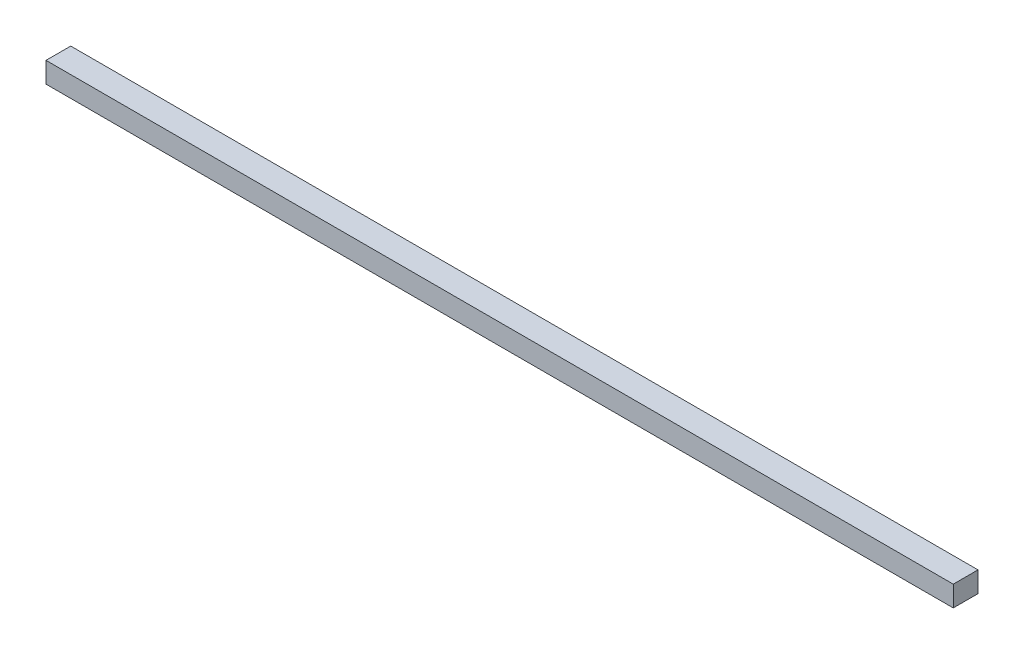
ISO-10303-21;
HEADER;
FILE_DESCRIPTION(('STEP AP214'),'2;1');
FILE_NAME('part.step','',(''),(''),'','','');
FILE_SCHEMA(('AUTOMOTIVE_DESIGN { 1 0 10303 214 1 1 1 1 }'));
ENDSEC;
DATA;
#1=APPLICATION_CONTEXT('core data for automotive mechanical design processes');
#2=APPLICATION_PROTOCOL_DEFINITION('international standard','automotive_design',2000,#1);
#3=PRODUCT_CONTEXT('',#1,'mechanical');
#4=PRODUCT('Part','Part','',(#3));
#5=PRODUCT_RELATED_PRODUCT_CATEGORY('part','',(#4));
#6=PRODUCT_DEFINITION_FORMATION('','',#4);
#7=PRODUCT_DEFINITION_CONTEXT('part definition',#1,'design');
#8=PRODUCT_DEFINITION('design','',#6,#7);
#9=PRODUCT_DEFINITION_SHAPE('','',#8);
#10=(LENGTH_UNIT() NAMED_UNIT(*) SI_UNIT(.MILLI.,.METRE.));
#11=(NAMED_UNIT(*) PLANE_ANGLE_UNIT() SI_UNIT($,.RADIAN.));
#12=(NAMED_UNIT(*) SI_UNIT($,.STERADIAN.) SOLID_ANGLE_UNIT());
#13=UNCERTAINTY_MEASURE_WITH_UNIT(LENGTH_MEASURE(1.E-05),#10,'distance_accuracy_value','');
#14=(GEOMETRIC_REPRESENTATION_CONTEXT(3) GLOBAL_UNCERTAINTY_ASSIGNED_CONTEXT((#13)) GLOBAL_UNIT_ASSIGNED_CONTEXT((#10,
#11,#12)) REPRESENTATION_CONTEXT('',''));
#15=CARTESIAN_POINT('',(0.,0.,0.));
#16=DIRECTION('',(0.,0.,1.));
#17=DIRECTION('',(1.,0.,0.));
#18=AXIS2_PLACEMENT_3D('',#15,#16,#17);
#19=CARTESIAN_POINT('',(349.25,7.9375,-9.525));
#20=DIRECTION('',(0.,0.,1.));
#21=DIRECTION('',(0.,-1.,0.));
#22=AXIS2_PLACEMENT_3D('',#19,#20,#21);
#23=PLANE('',#22);
#24=DIRECTION('',(0.,1.,0.));
#25=VECTOR('',#24,1.);
#26=CARTESIAN_POINT('',(-349.25,7.9375,-9.525));
#27=LINE('',#26,#25);
#28=CARTESIAN_POINT('',(-349.25,-7.9375,-9.525));
#29=VERTEX_POINT('',#28);
#30=CARTESIAN_POINT('',(-349.25,7.9375,-9.525));
#31=VERTEX_POINT('',#30);
#32=EDGE_CURVE('E93',#29,#31,#27,.T.);
#33=ORIENTED_EDGE('',*,*,#32,.T.);
#34=DIRECTION('',(-1.,0.,0.));
#35=VECTOR('',#34,1.);
#36=CARTESIAN_POINT('',(349.25,7.9375,-9.525));
#37=LINE('',#36,#35);
#38=CARTESIAN_POINT('',(349.25,7.9375,-9.525));
#39=VERTEX_POINT('',#38);
#40=EDGE_CURVE('E11',#39,#31,#37,.T.);
#41=ORIENTED_EDGE('',*,*,#40,.F.);
#42=DIRECTION('',(0.,1.,0.));
#43=VECTOR('',#42,1.);
#44=CARTESIAN_POINT('',(349.25,7.9375,-9.525));
#45=LINE('',#44,#43);
#46=CARTESIAN_POINT('',(349.25,-7.9375,-9.525));
#47=VERTEX_POINT('',#46);
#48=EDGE_CURVE('E81',#47,#39,#45,.T.);
#49=ORIENTED_EDGE('',*,*,#48,.F.);
#50=DIRECTION('',(-1.,0.,0.));
#51=VECTOR('',#50,1.);
#52=CARTESIAN_POINT('',(349.25,-7.9375,-9.525));
#53=LINE('',#52,#51);
#54=EDGE_CURVE('E89',#47,#29,#53,.T.);
#55=ORIENTED_EDGE('',*,*,#54,.T.);
#56=EDGE_LOOP('',(#33,#41,#49,#55));
#57=FACE_BOUND('',#56,.T.);
#58=ADVANCED_FACE('F30',(#57),#23,.F.);
#59=CARTESIAN_POINT('',(349.25,7.9375,9.52500000000001));
#60=DIRECTION('',(0.,-1.,0.));
#61=DIRECTION('',(0.,0.,-1.));
#62=AXIS2_PLACEMENT_3D('',#59,#60,#61);
#63=PLANE('',#62);
#64=DIRECTION('',(0.,0.,1.));
#65=VECTOR('',#64,1.);
#66=CARTESIAN_POINT('',(-349.25,7.9375,9.52500000000001));
#67=LINE('',#66,#65);
#68=CARTESIAN_POINT('',(-349.25,7.9375,9.52500000000001));
#69=VERTEX_POINT('',#68);
#70=EDGE_CURVE('E85',#31,#69,#67,.T.);
#71=ORIENTED_EDGE('',*,*,#70,.T.);
#72=DIRECTION('',(-1.,0.,0.));
#73=VECTOR('',#72,1.);
#74=CARTESIAN_POINT('',(349.25,7.9375,9.52500000000001));
#75=LINE('',#74,#73);
#76=CARTESIAN_POINT('',(349.25,7.9375,9.52500000000001));
#77=VERTEX_POINT('',#76);
#78=EDGE_CURVE('E38',#77,#69,#75,.T.);
#79=ORIENTED_EDGE('',*,*,#78,.F.);
#80=DIRECTION('',(0.,0.,1.));
#81=VECTOR('',#80,1.);
#82=CARTESIAN_POINT('',(349.25,7.9375,9.52500000000001));
#83=LINE('',#82,#81);
#84=EDGE_CURVE('E76',#39,#77,#83,.T.);
#85=ORIENTED_EDGE('',*,*,#84,.F.);
#86=ORIENTED_EDGE('',*,*,#40,.T.);
#87=EDGE_LOOP('',(#71,#79,#85,#86));
#88=FACE_BOUND('',#87,.T.);
#89=ADVANCED_FACE('F84',(#88),#63,.F.);
#90=CARTESIAN_POINT('',(349.25,7.9375,9.52500000000001));
#91=DIRECTION('',(0.,0.,-1.));
#92=DIRECTION('',(0.,1.,0.));
#93=AXIS2_PLACEMENT_3D('',#90,#91,#92);
#94=PLANE('',#93);
#95=DIRECTION('',(0.,-1.,0.));
#96=VECTOR('',#95,1.);
#97=CARTESIAN_POINT('',(-349.25,7.9375,9.52500000000001));
#98=LINE('',#97,#96);
#99=CARTESIAN_POINT('',(-349.25,-7.9375,9.525));
#100=VERTEX_POINT('',#99);
#101=EDGE_CURVE('E63',#69,#100,#98,.T.);
#102=ORIENTED_EDGE('',*,*,#101,.T.);
#103=DIRECTION('',(-1.,0.,0.));
#104=VECTOR('',#103,1.);
#105=CARTESIAN_POINT('',(349.25,-7.9375,9.525));
#106=LINE('',#105,#104);
#107=CARTESIAN_POINT('',(349.25,-7.9375,9.525));
#108=VERTEX_POINT('',#107);
#109=EDGE_CURVE('E86',#108,#100,#106,.T.);
#110=ORIENTED_EDGE('',*,*,#109,.F.);
#111=DIRECTION('',(0.,-1.,0.));
#112=VECTOR('',#111,1.);
#113=CARTESIAN_POINT('',(349.25,7.9375,9.52500000000001));
#114=LINE('',#113,#112);
#115=EDGE_CURVE('E79',#77,#108,#114,.T.);
#116=ORIENTED_EDGE('',*,*,#115,.F.);
#117=ORIENTED_EDGE('',*,*,#78,.T.);
#118=EDGE_LOOP('',(#102,#110,#116,#117));
#119=FACE_BOUND('',#118,.T.);
#120=ADVANCED_FACE('F87',(#119),#94,.F.);
#121=CARTESIAN_POINT('',(349.25,-7.9375,9.525));
#122=DIRECTION('',(0.,1.,0.));
#123=DIRECTION('',(0.,0.,1.));
#124=AXIS2_PLACEMENT_3D('',#121,#122,#123);
#125=PLANE('',#124);
#126=DIRECTION('',(0.,0.,-1.));
#127=VECTOR('',#126,1.);
#128=CARTESIAN_POINT('',(-349.25,-7.9375,9.525));
#129=LINE('',#128,#127);
#130=EDGE_CURVE('E69',#100,#29,#129,.T.);
#131=ORIENTED_EDGE('',*,*,#130,.T.);
#132=ORIENTED_EDGE('',*,*,#54,.F.);
#133=DIRECTION('',(0.,0.,-1.));
#134=VECTOR('',#133,1.);
#135=CARTESIAN_POINT('',(349.25,-7.9375,9.525));
#136=LINE('',#135,#134);
#137=EDGE_CURVE('E46',#108,#47,#136,.T.);
#138=ORIENTED_EDGE('',*,*,#137,.F.);
#139=ORIENTED_EDGE('',*,*,#109,.T.);
#140=EDGE_LOOP('',(#131,#132,#138,#139));
#141=FACE_BOUND('',#140,.T.);
#142=ADVANCED_FACE('F100',(#141),#125,.F.);
#143=CARTESIAN_POINT('',(349.25,0.,0.));
#144=DIRECTION('',(1.,0.,0.));
#145=DIRECTION('',(0.,0.,-1.));
#146=AXIS2_PLACEMENT_3D('',#143,#144,#145);
#147=PLANE('',#146);
#148=ORIENTED_EDGE('',*,*,#48,.T.);
#149=ORIENTED_EDGE('',*,*,#84,.T.);
#150=ORIENTED_EDGE('',*,*,#115,.T.);
#151=ORIENTED_EDGE('',*,*,#137,.T.);
#152=EDGE_LOOP('',(#148,#149,#150,#151));
#153=FACE_BOUND('',#152,.T.);
#154=ADVANCED_FACE('F77',(#153),#147,.T.);
#155=CARTESIAN_POINT('',(-349.25,0.,0.));
#156=DIRECTION('',(1.,0.,0.));
#157=DIRECTION('',(0.,0.,-1.));
#158=AXIS2_PLACEMENT_3D('',#155,#156,#157);
#159=PLANE('',#158);
#160=ORIENTED_EDGE('',*,*,#32,.F.);
#161=ORIENTED_EDGE('',*,*,#130,.F.);
#162=ORIENTED_EDGE('',*,*,#101,.F.);
#163=ORIENTED_EDGE('',*,*,#70,.F.);
#164=EDGE_LOOP('',(#160,#161,#162,#163));
#165=FACE_BOUND('',#164,.T.);
#166=ADVANCED_FACE('F103',(#165),#159,.F.);
#167=CLOSED_SHELL('',(#58,#89,#120,#142,#154,#166));
#168=MANIFOLD_SOLID_BREP('B2',#167);
#169=ADVANCED_BREP_SHAPE_REPRESENTATION('',(#18,#168),#14);
#170=SHAPE_DEFINITION_REPRESENTATION(#9,#169);
ENDSEC;
END-ISO-10303-21;
